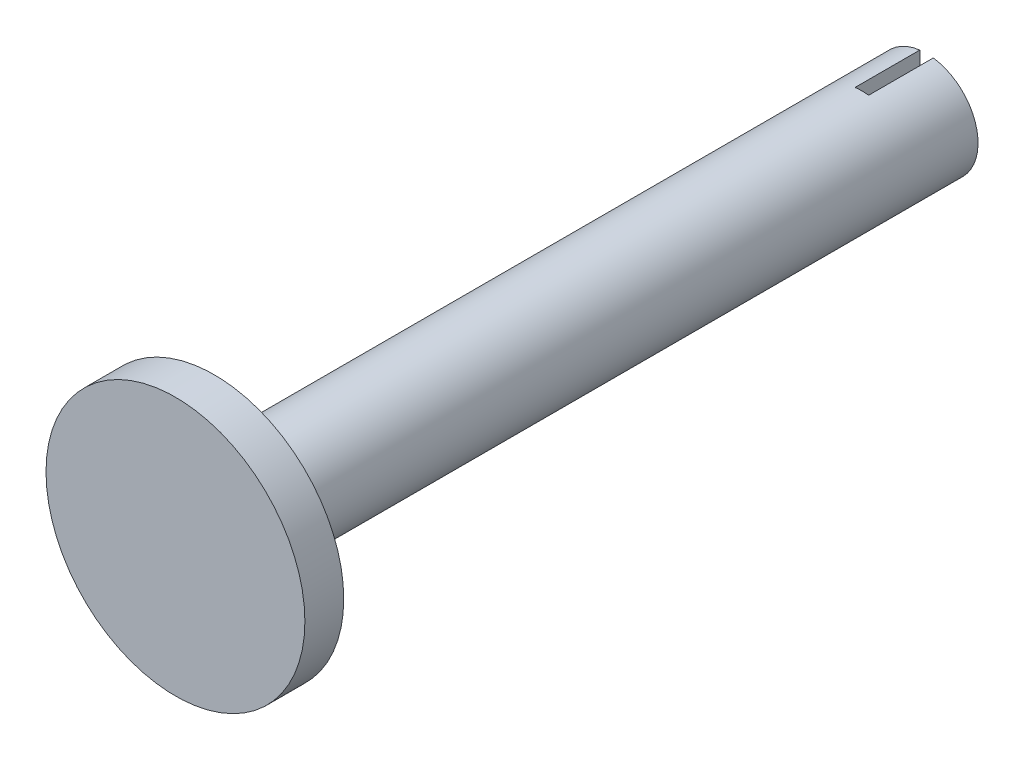
ISO-10303-21;
HEADER;
FILE_DESCRIPTION(('STEP AP214'),'2;1');
FILE_NAME('part.step','',(''),(''),'','','');
FILE_SCHEMA(('AUTOMOTIVE_DESIGN { 1 0 10303 214 1 1 1 1 }'));
ENDSEC;
DATA;
#1=APPLICATION_CONTEXT('core data for automotive mechanical design processes');
#2=APPLICATION_PROTOCOL_DEFINITION('international standard','automotive_design',2000,#1);
#3=PRODUCT_CONTEXT('',#1,'mechanical');
#4=PRODUCT('Part','Part','',(#3));
#5=PRODUCT_RELATED_PRODUCT_CATEGORY('part','',(#4));
#6=PRODUCT_DEFINITION_FORMATION('','',#4);
#7=PRODUCT_DEFINITION_CONTEXT('part definition',#1,'design');
#8=PRODUCT_DEFINITION('design','',#6,#7);
#9=PRODUCT_DEFINITION_SHAPE('','',#8);
#10=(LENGTH_UNIT() NAMED_UNIT(*) SI_UNIT(.MILLI.,.METRE.));
#11=(NAMED_UNIT(*) PLANE_ANGLE_UNIT() SI_UNIT($,.RADIAN.));
#12=(NAMED_UNIT(*) SI_UNIT($,.STERADIAN.) SOLID_ANGLE_UNIT());
#13=UNCERTAINTY_MEASURE_WITH_UNIT(LENGTH_MEASURE(1.E-05),#10,'distance_accuracy_value','');
#14=(GEOMETRIC_REPRESENTATION_CONTEXT(3) GLOBAL_UNCERTAINTY_ASSIGNED_CONTEXT((#13)) GLOBAL_UNIT_ASSIGNED_CONTEXT((#10,
#11,#12)) REPRESENTATION_CONTEXT('',''));
#15=CARTESIAN_POINT('',(0.,0.,0.));
#16=DIRECTION('',(0.,0.,1.));
#17=DIRECTION('',(1.,0.,0.));
#18=AXIS2_PLACEMENT_3D('',#15,#16,#17);
#19=CARTESIAN_POINT('',(0.,0.,-58.));
#20=DIRECTION('',(0.,0.,1.));
#21=DIRECTION('',(-1.,0.,0.));
#22=AXIS2_PLACEMENT_3D('',#19,#20,#21);
#23=CYLINDRICAL_SURFACE('',#22,4.);
#24=CARTESIAN_POINT('',(0.,0.,-3.));
#25=DIRECTION('',(0.,0.,1.));
#26=DIRECTION('',(1.,0.,0.));
#27=AXIS2_PLACEMENT_3D('',#24,#25,#26);
#28=CIRCLE('',#27,4.);
#29=CARTESIAN_POINT('',(4.,0.,-3.));
#30=VERTEX_POINT('',#29);
#31=EDGE_CURVE('E101',#30,#30,#28,.T.);
#32=ORIENTED_EDGE('',*,*,#31,.F.);
#33=EDGE_LOOP('',(#32));
#34=FACE_BOUND('',#33,.T.);
#35=DIRECTION('',(0.,0.,1.));
#36=VECTOR('',#35,1.);
#37=CARTESIAN_POINT('',(-0.5,3.96862696659689,-63.));
#38=LINE('',#37,#36);
#39=CARTESIAN_POINT('',(-0.5,3.96862696659689,-58.));
#40=VERTEX_POINT('',#39);
#41=CARTESIAN_POINT('',(-0.5,3.96862696659689,-53.));
#42=VERTEX_POINT('',#41);
#43=EDGE_CURVE('E88',#40,#42,#38,.T.);
#44=ORIENTED_EDGE('',*,*,#43,.F.);
#45=CARTESIAN_POINT('',(0.,0.,-58.));
#46=DIRECTION('',(0.,0.,1.));
#47=DIRECTION('',(1.,0.,0.));
#48=AXIS2_PLACEMENT_3D('',#45,#46,#47);
#49=CIRCLE('',#48,4.);
#50=CARTESIAN_POINT('',(0.543300128970735,3.96293136073039,-58.));
#51=VERTEX_POINT('',#50);
#52=EDGE_CURVE('E93',#40,#51,#49,.T.);
#53=ORIENTED_EDGE('',*,*,#52,.T.);
#54=DIRECTION('',(0.,0.,1.));
#55=VECTOR('',#54,1.);
#56=CARTESIAN_POINT('',(0.543300128970735,3.96293136073039,-63.));
#57=LINE('',#56,#55);
#58=CARTESIAN_POINT('',(0.543300128970735,3.96293136073039,-53.));
#59=VERTEX_POINT('',#58);
#60=EDGE_CURVE('E90',#51,#59,#57,.T.);
#61=ORIENTED_EDGE('',*,*,#60,.T.);
#62=CARTESIAN_POINT('',(0.,0.,-53.));
#63=DIRECTION('',(0.,0.,1.));
#64=DIRECTION('',(1.,0.,0.));
#65=AXIS2_PLACEMENT_3D('',#62,#63,#64);
#66=CIRCLE('',#65,4.);
#67=EDGE_CURVE('E80',#59,#42,#66,.T.);
#68=ORIENTED_EDGE('',*,*,#67,.T.);
#69=EDGE_LOOP('',(#44,#53,#61,#68));
#70=FACE_BOUND('',#69,.T.);
#71=ADVANCED_FACE('F35',(#34,#70),#23,.T.);
#72=CARTESIAN_POINT('',(0.,0.,-58.));
#73=DIRECTION('',(0.,0.,-1.));
#74=DIRECTION('',(1.,0.,0.));
#75=AXIS2_PLACEMENT_3D('',#72,#73,#74);
#76=PLANE('',#75);
#77=DIRECTION('',(-1.,0.,0.));
#78=VECTOR('',#77,1.);
#79=CARTESIAN_POINT('',(0.,2.76862696659689,-58.));
#80=LINE('',#79,#78);
#81=CARTESIAN_POINT('',(0.543300128970735,2.76862696659689,-58.));
#82=VERTEX_POINT('',#81);
#83=CARTESIAN_POINT('',(-0.5,2.76862696659689,-58.));
#84=VERTEX_POINT('',#83);
#85=EDGE_CURVE('E43',#82,#84,#80,.T.);
#86=ORIENTED_EDGE('',*,*,#85,.F.);
#87=DIRECTION('',(0.,-1.,0.));
#88=VECTOR('',#87,1.);
#89=CARTESIAN_POINT('',(0.543300128970734,0.,-58.));
#90=LINE('',#89,#88);
#91=EDGE_CURVE('E104',#51,#82,#90,.T.);
#92=ORIENTED_EDGE('',*,*,#91,.F.);
#93=ORIENTED_EDGE('',*,*,#52,.F.);
#94=DIRECTION('',(0.,1.,0.));
#95=VECTOR('',#94,1.);
#96=CARTESIAN_POINT('',(-0.499999999999999,0.,-58.));
#97=LINE('',#96,#95);
#98=EDGE_CURVE('E11',#84,#40,#97,.T.);
#99=ORIENTED_EDGE('',*,*,#98,.F.);
#100=EDGE_LOOP('',(#86,#92,#93,#99));
#101=FACE_BOUND('',#100,.T.);
#102=ADVANCED_FACE('F113',(#101),#76,.T.);
#103=CARTESIAN_POINT('',(0.,0.,-3.));
#104=DIRECTION('',(0.,0.,1.));
#105=DIRECTION('',(-1.,0.,0.));
#106=AXIS2_PLACEMENT_3D('',#103,#104,#105);
#107=CYLINDRICAL_SURFACE('',#106,10.);
#108=CARTESIAN_POINT('',(0.,0.,-3.));
#109=DIRECTION('',(0.,0.,1.));
#110=DIRECTION('',(1.,0.,0.));
#111=AXIS2_PLACEMENT_3D('',#108,#109,#110);
#112=CIRCLE('',#111,10.);
#113=CARTESIAN_POINT('',(10.,0.,-3.));
#114=VERTEX_POINT('',#113);
#115=EDGE_CURVE('E105',#114,#114,#112,.T.);
#116=ORIENTED_EDGE('',*,*,#115,.T.);
#117=EDGE_LOOP('',(#116));
#118=FACE_BOUND('',#117,.T.);
#119=CARTESIAN_POINT('',(0.,0.,0.));
#120=DIRECTION('',(0.,0.,1.));
#121=DIRECTION('',(1.,0.,0.));
#122=AXIS2_PLACEMENT_3D('',#119,#120,#121);
#123=CIRCLE('',#122,10.);
#124=CARTESIAN_POINT('',(10.,0.,0.));
#125=VERTEX_POINT('',#124);
#126=EDGE_CURVE('E96',#125,#125,#123,.T.);
#127=ORIENTED_EDGE('',*,*,#126,.F.);
#128=EDGE_LOOP('',(#127));
#129=FACE_BOUND('',#128,.T.);
#130=ADVANCED_FACE('F37',(#118,#129),#107,.T.);
#131=CARTESIAN_POINT('',(0.,0.,-3.));
#132=DIRECTION('',(0.,0.,-1.));
#133=DIRECTION('',(1.,0.,0.));
#134=AXIS2_PLACEMENT_3D('',#131,#132,#133);
#135=PLANE('',#134);
#136=ORIENTED_EDGE('',*,*,#31,.T.);
#137=EDGE_LOOP('',(#136));
#138=FACE_BOUND('',#137,.T.);
#139=ORIENTED_EDGE('',*,*,#115,.F.);
#140=EDGE_LOOP('',(#139));
#141=FACE_BOUND('',#140,.T.);
#142=ADVANCED_FACE('F138',(#138,#141),#135,.T.);
#143=CARTESIAN_POINT('',(0.,0.,0.));
#144=DIRECTION('',(0.,0.,-1.));
#145=DIRECTION('',(1.,0.,0.));
#146=AXIS2_PLACEMENT_3D('',#143,#144,#145);
#147=PLANE('',#146);
#148=ORIENTED_EDGE('',*,*,#126,.T.);
#149=EDGE_LOOP('',(#148));
#150=FACE_BOUND('',#149,.T.);
#151=ADVANCED_FACE('F140',(#150),#147,.F.);
#152=CARTESIAN_POINT('',(-0.5,3.96862696659689,-63.));
#153=DIRECTION('',(1.,0.,0.));
#154=DIRECTION('',(0.,1.,0.));
#155=AXIS2_PLACEMENT_3D('',#152,#153,#154);
#156=PLANE('',#155);
#157=DIRECTION('',(0.,0.,1.));
#158=VECTOR('',#157,1.);
#159=CARTESIAN_POINT('',(-0.5,2.76862696659689,-63.));
#160=LINE('',#159,#158);
#161=CARTESIAN_POINT('',(-0.5,2.76862696659689,-53.));
#162=VERTEX_POINT('',#161);
#163=EDGE_CURVE('E94',#84,#162,#160,.T.);
#164=ORIENTED_EDGE('',*,*,#163,.F.);
#165=ORIENTED_EDGE('',*,*,#98,.T.);
#166=ORIENTED_EDGE('',*,*,#43,.T.);
#167=DIRECTION('',(0.,-1.,0.));
#168=VECTOR('',#167,1.);
#169=CARTESIAN_POINT('',(-0.5,3.96862696659689,-53.));
#170=LINE('',#169,#168);
#171=EDGE_CURVE('E77',#42,#162,#170,.T.);
#172=ORIENTED_EDGE('',*,*,#171,.T.);
#173=EDGE_LOOP('',(#164,#165,#166,#172));
#174=FACE_BOUND('',#173,.T.);
#175=ADVANCED_FACE('F92',(#174),#156,.T.);
#176=CARTESIAN_POINT('',(-0.5,2.76862696659689,-63.));
#177=DIRECTION('',(0.,1.,0.));
#178=DIRECTION('',(0.,0.,-1.));
#179=AXIS2_PLACEMENT_3D('',#176,#177,#178);
#180=PLANE('',#179);
#181=DIRECTION('',(0.,0.,1.));
#182=VECTOR('',#181,1.);
#183=CARTESIAN_POINT('',(0.543300128970735,2.76862696659689,-63.));
#184=LINE('',#183,#182);
#185=CARTESIAN_POINT('',(0.543300128970735,2.76862696659689,-53.));
#186=VERTEX_POINT('',#185);
#187=EDGE_CURVE('E50',#82,#186,#184,.T.);
#188=ORIENTED_EDGE('',*,*,#187,.F.);
#189=ORIENTED_EDGE('',*,*,#85,.T.);
#190=ORIENTED_EDGE('',*,*,#163,.T.);
#191=DIRECTION('',(1.,0.,0.));
#192=VECTOR('',#191,1.);
#193=CARTESIAN_POINT('',(-0.5,2.76862696659689,-53.));
#194=LINE('',#193,#192);
#195=EDGE_CURVE('E82',#162,#186,#194,.T.);
#196=ORIENTED_EDGE('',*,*,#195,.T.);
#197=EDGE_LOOP('',(#188,#189,#190,#196));
#198=FACE_BOUND('',#197,.T.);
#199=ADVANCED_FACE('F111',(#198),#180,.T.);
#200=CARTESIAN_POINT('',(0.543300128970735,2.76862696659689,-63.));
#201=DIRECTION('',(-1.,0.,0.));
#202=DIRECTION('',(0.,-1.,0.));
#203=AXIS2_PLACEMENT_3D('',#200,#201,#202);
#204=PLANE('',#203);
#205=ORIENTED_EDGE('',*,*,#60,.F.);
#206=ORIENTED_EDGE('',*,*,#91,.T.);
#207=ORIENTED_EDGE('',*,*,#187,.T.);
#208=DIRECTION('',(0.,1.,0.));
#209=VECTOR('',#208,1.);
#210=CARTESIAN_POINT('',(0.543300128970735,2.76862696659689,-53.));
#211=LINE('',#210,#209);
#212=EDGE_CURVE('E116',#186,#59,#211,.T.);
#213=ORIENTED_EDGE('',*,*,#212,.T.);
#214=EDGE_LOOP('',(#205,#206,#207,#213));
#215=FACE_BOUND('',#214,.T.);
#216=ADVANCED_FACE('F115',(#215),#204,.T.);
#217=CARTESIAN_POINT('',(0.,0.,-53.));
#218=DIRECTION('',(0.,0.,-1.));
#219=DIRECTION('',(1.,0.,0.));
#220=AXIS2_PLACEMENT_3D('',#217,#218,#219);
#221=PLANE('',#220);
#222=ORIENTED_EDGE('',*,*,#67,.F.);
#223=ORIENTED_EDGE('',*,*,#212,.F.);
#224=ORIENTED_EDGE('',*,*,#195,.F.);
#225=ORIENTED_EDGE('',*,*,#171,.F.);
#226=EDGE_LOOP('',(#222,#223,#224,#225));
#227=FACE_BOUND('',#226,.T.);
#228=ADVANCED_FACE('F79',(#227),#221,.T.);
#229=CLOSED_SHELL('',(#71,#102,#130,#142,#151,#175,#199,#216,#228));
#230=MANIFOLD_SOLID_BREP('B2',#229);
#231=ADVANCED_BREP_SHAPE_REPRESENTATION('',(#18,#230),#14);
#232=SHAPE_DEFINITION_REPRESENTATION(#9,#231);
ENDSEC;
END-ISO-10303-21;
